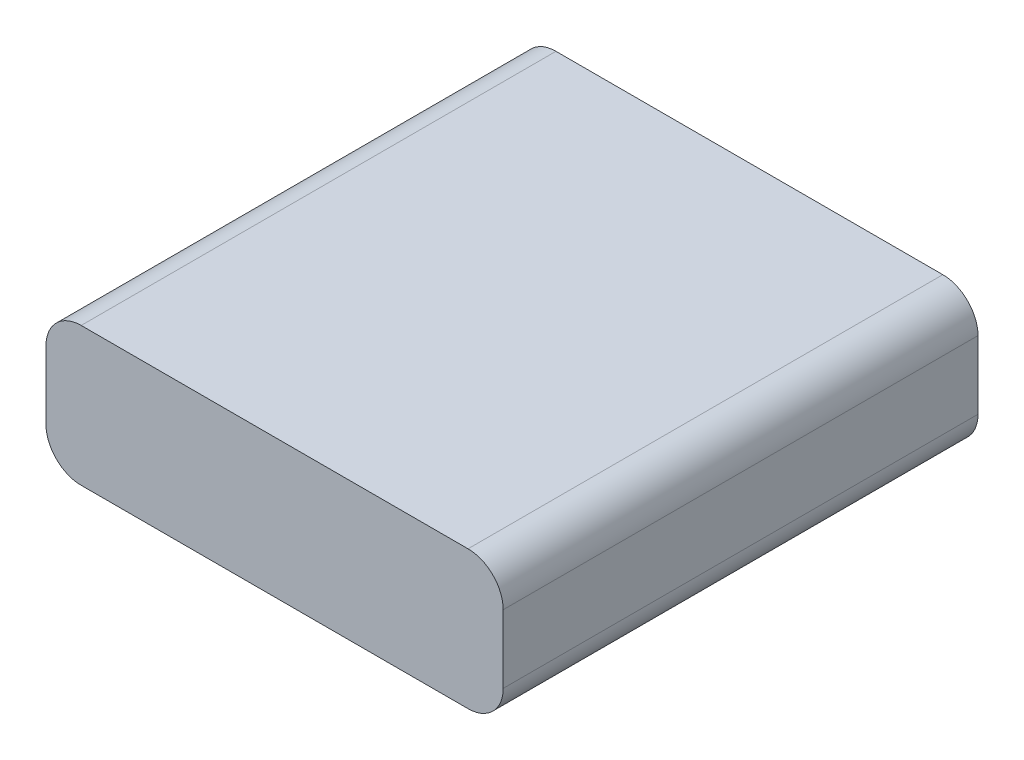
ISO-10303-21;
HEADER;
FILE_DESCRIPTION(('STEP AP214'),'2;1');
FILE_NAME('part.step','',(''),(''),'','','');
FILE_SCHEMA(('AUTOMOTIVE_DESIGN { 1 0 10303 214 1 1 1 1 }'));
ENDSEC;
DATA;
#1=APPLICATION_CONTEXT('core data for automotive mechanical design processes');
#2=APPLICATION_PROTOCOL_DEFINITION('international standard','automotive_design',2000,#1);
#3=PRODUCT_CONTEXT('',#1,'mechanical');
#4=PRODUCT('Part','Part','',(#3));
#5=PRODUCT_RELATED_PRODUCT_CATEGORY('part','',(#4));
#6=PRODUCT_DEFINITION_FORMATION('','',#4);
#7=PRODUCT_DEFINITION_CONTEXT('part definition',#1,'design');
#8=PRODUCT_DEFINITION('design','',#6,#7);
#9=PRODUCT_DEFINITION_SHAPE('','',#8);
#10=(LENGTH_UNIT() NAMED_UNIT(*) SI_UNIT(.MILLI.,.METRE.));
#11=(NAMED_UNIT(*) PLANE_ANGLE_UNIT() SI_UNIT($,.RADIAN.));
#12=(NAMED_UNIT(*) SI_UNIT($,.STERADIAN.) SOLID_ANGLE_UNIT());
#13=UNCERTAINTY_MEASURE_WITH_UNIT(LENGTH_MEASURE(1.E-05),#10,'distance_accuracy_value','');
#14=(GEOMETRIC_REPRESENTATION_CONTEXT(3) GLOBAL_UNCERTAINTY_ASSIGNED_CONTEXT((#13)) GLOBAL_UNIT_ASSIGNED_CONTEXT((#10,
#11,#12)) REPRESENTATION_CONTEXT('',''));
#15=CARTESIAN_POINT('',(0.,0.,0.));
#16=DIRECTION('',(0.,0.,1.));
#17=DIRECTION('',(1.,0.,0.));
#18=AXIS2_PLACEMENT_3D('',#15,#16,#17);
#19=CARTESIAN_POINT('',(33.02,20.,-34.29));
#20=DIRECTION('',(-1.,0.,0.));
#21=DIRECTION('',(0.,0.,1.));
#22=AXIS2_PLACEMENT_3D('',#19,#20,#21);
#23=PLANE('',#22);
#24=DIRECTION('',(0.,-1.,0.));
#25=VECTOR('',#24,1.);
#26=CARTESIAN_POINT('',(33.02,20.,34.29));
#27=LINE('',#26,#25);
#28=CARTESIAN_POINT('',(33.02,14.92,34.29));
#29=VERTEX_POINT('',#28);
#30=CARTESIAN_POINT('',(33.02,5.08,34.29));
#31=VERTEX_POINT('',#30);
#32=EDGE_CURVE('E118',#29,#31,#27,.T.);
#33=ORIENTED_EDGE('',*,*,#32,.T.);
#34=DIRECTION('',(0.,0.,-1.));
#35=VECTOR('',#34,1.);
#36=CARTESIAN_POINT('',(33.02,5.08,-34.29));
#37=LINE('',#36,#35);
#38=CARTESIAN_POINT('',(33.02,5.08,-34.29));
#39=VERTEX_POINT('',#38);
#40=EDGE_CURVE('E11',#31,#39,#37,.T.);
#41=ORIENTED_EDGE('',*,*,#40,.T.);
#42=DIRECTION('',(0.,-1.,0.));
#43=VECTOR('',#42,1.);
#44=CARTESIAN_POINT('',(33.02,20.,-34.29));
#45=LINE('',#44,#43);
#46=CARTESIAN_POINT('',(33.02,14.92,-34.29));
#47=VERTEX_POINT('',#46);
#48=EDGE_CURVE('E123',#47,#39,#45,.T.);
#49=ORIENTED_EDGE('',*,*,#48,.F.);
#50=DIRECTION('',(0.,0.,-1.));
#51=VECTOR('',#50,1.);
#52=CARTESIAN_POINT('',(33.02,14.92,34.29));
#53=LINE('',#52,#51);
#54=EDGE_CURVE('E38',#47,#29,#53,.F.);
#55=ORIENTED_EDGE('',*,*,#54,.T.);
#56=EDGE_LOOP('',(#33,#41,#49,#55));
#57=FACE_BOUND('',#56,.T.);
#58=ADVANCED_FACE('F30',(#57),#23,.F.);
#59=CARTESIAN_POINT('',(-33.02,20.,-34.29));
#60=DIRECTION('',(0.,0.,1.));
#61=DIRECTION('',(1.,0.,0.));
#62=AXIS2_PLACEMENT_3D('',#59,#60,#61);
#63=PLANE('',#62);
#64=DIRECTION('',(-1.,0.,0.));
#65=VECTOR('',#64,1.);
#66=CARTESIAN_POINT('',(-33.02,0.,-34.29));
#67=LINE('',#66,#65);
#68=CARTESIAN_POINT('',(27.94,0.,-34.29));
#69=VERTEX_POINT('',#68);
#70=CARTESIAN_POINT('',(-27.94,0.,-34.29));
#71=VERTEX_POINT('',#70);
#72=EDGE_CURVE('E165',#69,#71,#67,.T.);
#73=ORIENTED_EDGE('',*,*,#72,.T.);
#74=CARTESIAN_POINT('',(-27.94,5.08,-34.29));
#75=DIRECTION('',(0.,0.,1.));
#76=DIRECTION('',(1.,0.,0.));
#77=AXIS2_PLACEMENT_3D('',#74,#75,#76);
#78=CIRCLE('',#77,5.08);
#79=CARTESIAN_POINT('',(-33.02,5.08,-34.29));
#80=VERTEX_POINT('',#79);
#81=EDGE_CURVE('E140',#71,#80,#78,.F.);
#82=ORIENTED_EDGE('',*,*,#81,.T.);
#83=DIRECTION('',(0.,-1.,0.));
#84=VECTOR('',#83,1.);
#85=CARTESIAN_POINT('',(-33.02,20.,-34.29));
#86=LINE('',#85,#84);
#87=CARTESIAN_POINT('',(-33.02,14.92,-34.29));
#88=VERTEX_POINT('',#87);
#89=EDGE_CURVE('E117',#88,#80,#86,.T.);
#90=ORIENTED_EDGE('',*,*,#89,.F.);
#91=CARTESIAN_POINT('',(-27.94,14.92,-34.29));
#92=DIRECTION('',(0.,0.,1.));
#93=DIRECTION('',(1.,0.,0.));
#94=AXIS2_PLACEMENT_3D('',#91,#92,#93);
#95=CIRCLE('',#94,5.08);
#96=CARTESIAN_POINT('',(-27.94,20.,-34.29));
#97=VERTEX_POINT('',#96);
#98=EDGE_CURVE('E122',#88,#97,#95,.F.);
#99=ORIENTED_EDGE('',*,*,#98,.T.);
#100=DIRECTION('',(-1.,0.,0.));
#101=VECTOR('',#100,1.);
#102=CARTESIAN_POINT('',(-33.02,20.,-34.29));
#103=LINE('',#102,#101);
#104=CARTESIAN_POINT('',(27.94,20.,-34.29));
#105=VERTEX_POINT('',#104);
#106=EDGE_CURVE('E159',#105,#97,#103,.T.);
#107=ORIENTED_EDGE('',*,*,#106,.F.);
#108=CARTESIAN_POINT('',(27.94,14.92,-34.29));
#109=DIRECTION('',(0.,0.,1.));
#110=DIRECTION('',(1.,0.,0.));
#111=AXIS2_PLACEMENT_3D('',#108,#109,#110);
#112=CIRCLE('',#111,5.08);
#113=EDGE_CURVE('E52',#105,#47,#112,.F.);
#114=ORIENTED_EDGE('',*,*,#113,.T.);
#115=ORIENTED_EDGE('',*,*,#48,.T.);
#116=CARTESIAN_POINT('',(27.94,5.08,-34.29));
#117=DIRECTION('',(0.,0.,1.));
#118=DIRECTION('',(1.,0.,0.));
#119=AXIS2_PLACEMENT_3D('',#116,#117,#118);
#120=CIRCLE('',#119,5.08);
#121=EDGE_CURVE('E45',#39,#69,#120,.F.);
#122=ORIENTED_EDGE('',*,*,#121,.T.);
#123=EDGE_LOOP('',(#73,#82,#90,#99,#107,#114,#115,#122));
#124=FACE_BOUND('',#123,.T.);
#125=ADVANCED_FACE('F161',(#124),#63,.F.);
#126=CARTESIAN_POINT('',(-33.02,20.,-34.29));
#127=DIRECTION('',(1.,0.,0.));
#128=DIRECTION('',(0.,0.,-1.));
#129=AXIS2_PLACEMENT_3D('',#126,#127,#128);
#130=PLANE('',#129);
#131=ORIENTED_EDGE('',*,*,#89,.T.);
#132=DIRECTION('',(0.,0.,1.));
#133=VECTOR('',#132,1.);
#134=CARTESIAN_POINT('',(-33.02,5.08,-34.29));
#135=LINE('',#134,#133);
#136=CARTESIAN_POINT('',(-33.02,5.08,34.29));
#137=VERTEX_POINT('',#136);
#138=EDGE_CURVE('E116',#80,#137,#135,.T.);
#139=ORIENTED_EDGE('',*,*,#138,.T.);
#140=DIRECTION('',(0.,-1.,0.));
#141=VECTOR('',#140,1.);
#142=CARTESIAN_POINT('',(-33.02,20.,34.29));
#143=LINE('',#142,#141);
#144=CARTESIAN_POINT('',(-33.02,14.92,34.29));
#145=VERTEX_POINT('',#144);
#146=EDGE_CURVE('E99',#145,#137,#143,.T.);
#147=ORIENTED_EDGE('',*,*,#146,.F.);
#148=DIRECTION('',(0.,0.,1.));
#149=VECTOR('',#148,1.);
#150=CARTESIAN_POINT('',(-33.02,14.92,-34.29));
#151=LINE('',#150,#149);
#152=EDGE_CURVE('E113',#145,#88,#151,.F.);
#153=ORIENTED_EDGE('',*,*,#152,.T.);
#154=EDGE_LOOP('',(#131,#139,#147,#153));
#155=FACE_BOUND('',#154,.T.);
#156=ADVANCED_FACE('F112',(#155),#130,.F.);
#157=CARTESIAN_POINT('',(-33.02,20.,34.29));
#158=DIRECTION('',(0.,0.,-1.));
#159=DIRECTION('',(-1.,0.,0.));
#160=AXIS2_PLACEMENT_3D('',#157,#158,#159);
#161=PLANE('',#160);
#162=ORIENTED_EDGE('',*,*,#146,.T.);
#163=CARTESIAN_POINT('',(-27.94,5.08,34.29));
#164=DIRECTION('',(0.,0.,-1.));
#165=DIRECTION('',(-1.,0.,0.));
#166=AXIS2_PLACEMENT_3D('',#163,#164,#165);
#167=CIRCLE('',#166,5.08);
#168=CARTESIAN_POINT('',(-27.94,0.,34.29));
#169=VERTEX_POINT('',#168);
#170=EDGE_CURVE('E106',#137,#169,#167,.F.);
#171=ORIENTED_EDGE('',*,*,#170,.T.);
#172=DIRECTION('',(1.,0.,0.));
#173=VECTOR('',#172,1.);
#174=CARTESIAN_POINT('',(-33.02,0.,34.29));
#175=LINE('',#174,#173);
#176=CARTESIAN_POINT('',(27.94,0.,34.29));
#177=VERTEX_POINT('',#176);
#178=EDGE_CURVE('E162',#169,#177,#175,.T.);
#179=ORIENTED_EDGE('',*,*,#178,.T.);
#180=CARTESIAN_POINT('',(27.94,5.08,34.29));
#181=DIRECTION('',(0.,0.,-1.));
#182=DIRECTION('',(-1.,0.,0.));
#183=AXIS2_PLACEMENT_3D('',#180,#181,#182);
#184=CIRCLE('',#183,5.08);
#185=EDGE_CURVE('E107',#177,#31,#184,.F.);
#186=ORIENTED_EDGE('',*,*,#185,.T.);
#187=ORIENTED_EDGE('',*,*,#32,.F.);
#188=CARTESIAN_POINT('',(27.94,14.92,34.29));
#189=DIRECTION('',(0.,0.,-1.));
#190=DIRECTION('',(-1.,0.,0.));
#191=AXIS2_PLACEMENT_3D('',#188,#189,#190);
#192=CIRCLE('',#191,5.08);
#193=CARTESIAN_POINT('',(27.94,20.,34.29));
#194=VERTEX_POINT('',#193);
#195=EDGE_CURVE('E125',#29,#194,#192,.F.);
#196=ORIENTED_EDGE('',*,*,#195,.T.);
#197=DIRECTION('',(1.,0.,0.));
#198=VECTOR('',#197,1.);
#199=CARTESIAN_POINT('',(-33.02,20.,34.29));
#200=LINE('',#199,#198);
#201=CARTESIAN_POINT('',(-27.94,20.,34.29));
#202=VERTEX_POINT('',#201);
#203=EDGE_CURVE('E101',#202,#194,#200,.T.);
#204=ORIENTED_EDGE('',*,*,#203,.F.);
#205=CARTESIAN_POINT('',(-27.94,14.92,34.29));
#206=DIRECTION('',(0.,0.,-1.));
#207=DIRECTION('',(-1.,0.,0.));
#208=AXIS2_PLACEMENT_3D('',#205,#206,#207);
#209=CIRCLE('',#208,5.08);
#210=EDGE_CURVE('E96',#202,#145,#209,.F.);
#211=ORIENTED_EDGE('',*,*,#210,.T.);
#212=EDGE_LOOP('',(#162,#171,#179,#186,#187,#196,#204,#211));
#213=FACE_BOUND('',#212,.T.);
#214=ADVANCED_FACE('F98',(#213),#161,.F.);
#215=CARTESIAN_POINT('',(33.02,20.,34.29));
#216=DIRECTION('',(0.,1.,0.));
#217=DIRECTION('',(0.,0.,1.));
#218=AXIS2_PLACEMENT_3D('',#215,#216,#217);
#219=PLANE('',#218);
#220=ORIENTED_EDGE('',*,*,#106,.T.);
#221=DIRECTION('',(0.,0.,1.));
#222=VECTOR('',#221,1.);
#223=CARTESIAN_POINT('',(-27.94,20.,34.29));
#224=LINE('',#223,#222);
#225=EDGE_CURVE('E145',#97,#202,#224,.T.);
#226=ORIENTED_EDGE('',*,*,#225,.T.);
#227=ORIENTED_EDGE('',*,*,#203,.T.);
#228=DIRECTION('',(0.,0.,-1.));
#229=VECTOR('',#228,1.);
#230=CARTESIAN_POINT('',(27.94,20.,-34.29));
#231=LINE('',#230,#229);
#232=EDGE_CURVE('E142',#194,#105,#231,.T.);
#233=ORIENTED_EDGE('',*,*,#232,.T.);
#234=EDGE_LOOP('',(#220,#226,#227,#233));
#235=FACE_BOUND('',#234,.T.);
#236=ADVANCED_FACE('F158',(#235),#219,.T.);
#237=CARTESIAN_POINT('',(33.02,0.,34.29));
#238=DIRECTION('',(0.,1.,0.));
#239=DIRECTION('',(0.,0.,1.));
#240=AXIS2_PLACEMENT_3D('',#237,#238,#239);
#241=PLANE('',#240);
#242=ORIENTED_EDGE('',*,*,#178,.F.);
#243=DIRECTION('',(0.,0.,1.));
#244=VECTOR('',#243,1.);
#245=CARTESIAN_POINT('',(-27.94,0.,34.29));
#246=LINE('',#245,#244);
#247=EDGE_CURVE('E135',#169,#71,#246,.F.);
#248=ORIENTED_EDGE('',*,*,#247,.T.);
#249=ORIENTED_EDGE('',*,*,#72,.F.);
#250=DIRECTION('',(0.,0.,-1.));
#251=VECTOR('',#250,1.);
#252=CARTESIAN_POINT('',(27.94,0.,34.29));
#253=LINE('',#252,#251);
#254=EDGE_CURVE('E133',#69,#177,#253,.F.);
#255=ORIENTED_EDGE('',*,*,#254,.T.);
#256=EDGE_LOOP('',(#242,#248,#249,#255));
#257=FACE_BOUND('',#256,.T.);
#258=ADVANCED_FACE('F174',(#257),#241,.F.);
#259=CARTESIAN_POINT('',(-27.94,5.08,-34.29));
#260=DIRECTION('',(0.,0.,1.));
#261=DIRECTION('',(1.,0.,0.));
#262=AXIS2_PLACEMENT_3D('',#259,#260,#261);
#263=CYLINDRICAL_SURFACE('',#262,5.08);
#264=ORIENTED_EDGE('',*,*,#81,.F.);
#265=ORIENTED_EDGE('',*,*,#247,.F.);
#266=ORIENTED_EDGE('',*,*,#170,.F.);
#267=ORIENTED_EDGE('',*,*,#138,.F.);
#268=EDGE_LOOP('',(#264,#265,#266,#267));
#269=FACE_BOUND('',#268,.T.);
#270=ADVANCED_FACE('F170',(#269),#263,.T.);
#271=CARTESIAN_POINT('',(-27.94,14.92,34.29));
#272=DIRECTION('',(0.,0.,-1.));
#273=DIRECTION('',(-1.,0.,0.));
#274=AXIS2_PLACEMENT_3D('',#271,#272,#273);
#275=CYLINDRICAL_SURFACE('',#274,5.08);
#276=ORIENTED_EDGE('',*,*,#98,.F.);
#277=ORIENTED_EDGE('',*,*,#152,.F.);
#278=ORIENTED_EDGE('',*,*,#210,.F.);
#279=ORIENTED_EDGE('',*,*,#225,.F.);
#280=EDGE_LOOP('',(#276,#277,#278,#279));
#281=FACE_BOUND('',#280,.T.);
#282=ADVANCED_FACE('F121',(#281),#275,.T.);
#283=CARTESIAN_POINT('',(27.94,5.08,-34.29));
#284=DIRECTION('',(0.,0.,-1.));
#285=DIRECTION('',(-1.,0.,0.));
#286=AXIS2_PLACEMENT_3D('',#283,#284,#285);
#287=CYLINDRICAL_SURFACE('',#286,5.08);
#288=ORIENTED_EDGE('',*,*,#185,.F.);
#289=ORIENTED_EDGE('',*,*,#254,.F.);
#290=ORIENTED_EDGE('',*,*,#121,.F.);
#291=ORIENTED_EDGE('',*,*,#40,.F.);
#292=EDGE_LOOP('',(#288,#289,#290,#291));
#293=FACE_BOUND('',#292,.T.);
#294=ADVANCED_FACE('F176',(#293),#287,.T.);
#295=CARTESIAN_POINT('',(27.94,14.92,34.29));
#296=DIRECTION('',(0.,0.,1.));
#297=DIRECTION('',(1.,0.,0.));
#298=AXIS2_PLACEMENT_3D('',#295,#296,#297);
#299=CYLINDRICAL_SURFACE('',#298,5.08);
#300=ORIENTED_EDGE('',*,*,#195,.F.);
#301=ORIENTED_EDGE('',*,*,#54,.F.);
#302=ORIENTED_EDGE('',*,*,#113,.F.);
#303=ORIENTED_EDGE('',*,*,#232,.F.);
#304=EDGE_LOOP('',(#300,#301,#302,#303));
#305=FACE_BOUND('',#304,.T.);
#306=ADVANCED_FACE('F32',(#305),#299,.T.);
#307=CLOSED_SHELL('',(#58,#125,#156,#214,#236,#258,#270,#282,#294,#306));
#308=MANIFOLD_SOLID_BREP('B2',#307);
#309=ADVANCED_BREP_SHAPE_REPRESENTATION('',(#18,#308),#14);
#310=SHAPE_DEFINITION_REPRESENTATION(#9,#309);
ENDSEC;
END-ISO-10303-21;
